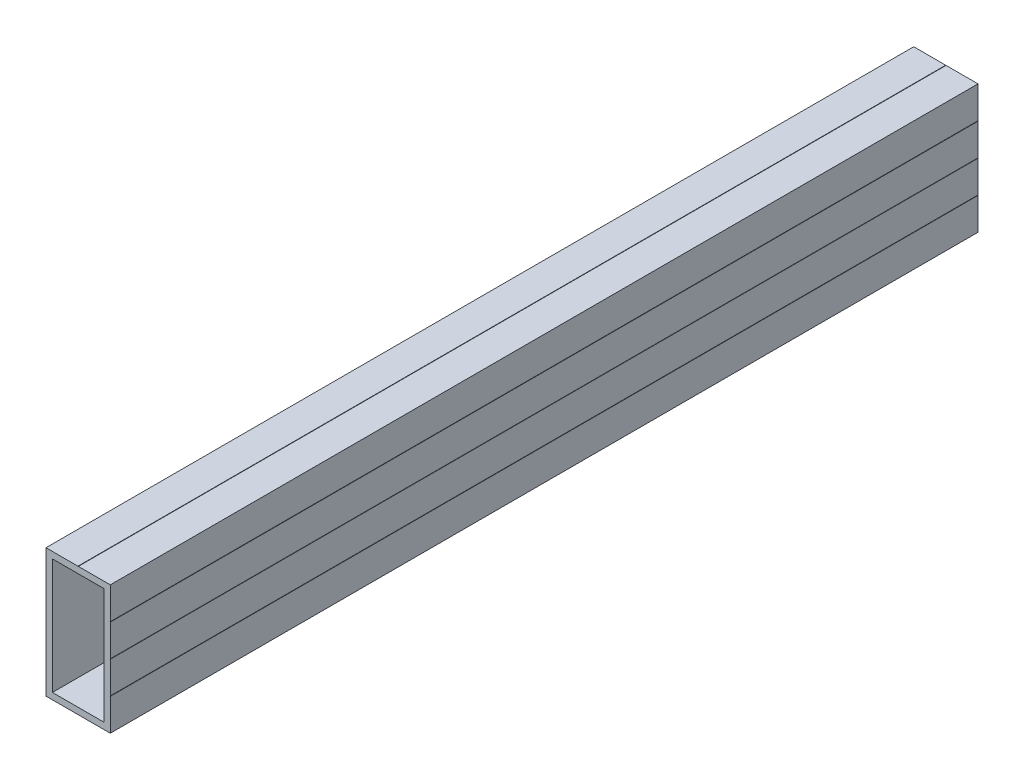
ISO-10303-21;
HEADER;
FILE_DESCRIPTION(('STEP AP214'),'2;1');
FILE_NAME('part.step','',(''),(''),'','','');
FILE_SCHEMA(('AUTOMOTIVE_DESIGN { 1 0 10303 214 1 1 1 1 }'));
ENDSEC;
DATA;
#1=APPLICATION_CONTEXT('core data for automotive mechanical design processes');
#2=APPLICATION_PROTOCOL_DEFINITION('international standard','automotive_design',2000,#1);
#3=PRODUCT_CONTEXT('',#1,'mechanical');
#4=PRODUCT('Part','Part','',(#3));
#5=PRODUCT_RELATED_PRODUCT_CATEGORY('part','',(#4));
#6=PRODUCT_DEFINITION_FORMATION('','',#4);
#7=PRODUCT_DEFINITION_CONTEXT('part definition',#1,'design');
#8=PRODUCT_DEFINITION('design','',#6,#7);
#9=PRODUCT_DEFINITION_SHAPE('','',#8);
#10=(LENGTH_UNIT() NAMED_UNIT(*) SI_UNIT(.MILLI.,.METRE.));
#11=(NAMED_UNIT(*) PLANE_ANGLE_UNIT() SI_UNIT($,.RADIAN.));
#12=(NAMED_UNIT(*) SI_UNIT($,.STERADIAN.) SOLID_ANGLE_UNIT());
#13=UNCERTAINTY_MEASURE_WITH_UNIT(LENGTH_MEASURE(1.E-05),#10,'distance_accuracy_value','');
#14=(GEOMETRIC_REPRESENTATION_CONTEXT(3) GLOBAL_UNCERTAINTY_ASSIGNED_CONTEXT((#13)) GLOBAL_UNIT_ASSIGNED_CONTEXT((#10,
#11,#12)) REPRESENTATION_CONTEXT('',''));
#15=CARTESIAN_POINT('',(0.,0.,0.));
#16=DIRECTION('',(0.,0.,1.));
#17=DIRECTION('',(1.,0.,0.));
#18=AXIS2_PLACEMENT_3D('',#15,#16,#17);
#19=CARTESIAN_POINT('',(-12.7,0.,0.));
#20=DIRECTION('',(1.,0.,0.));
#21=DIRECTION('',(0.,0.,-1.));
#22=AXIS2_PLACEMENT_3D('',#19,#20,#21);
#23=PLANE('',#22);
#24=DIRECTION('',(0.,0.,1.));
#25=VECTOR('',#24,1.);
#26=CARTESIAN_POINT('',(-12.7,25.4,-749.3));
#27=LINE('',#26,#25);
#28=CARTESIAN_POINT('',(-12.7,25.4,406.4));
#29=VERTEX_POINT('',#28);
#30=CARTESIAN_POINT('',(-12.7,25.4,749.3));
#31=VERTEX_POINT('',#30);
#32=EDGE_CURVE('E335',#29,#31,#27,.T.);
#33=ORIENTED_EDGE('',*,*,#32,.F.);
#34=DIRECTION('',(0.,-1.,0.));
#35=VECTOR('',#34,1.);
#36=CARTESIAN_POINT('',(-12.7,0.,406.4));
#37=LINE('',#36,#35);
#38=CARTESIAN_POINT('',(-12.7000000000132,12.7762,406.4));
#39=VERTEX_POINT('',#38);
#40=EDGE_CURVE('E408',#29,#39,#37,.T.);
#41=ORIENTED_EDGE('',*,*,#40,.T.);
#42=DIRECTION('',(0.,0.,1.));
#43=VECTOR('',#42,1.);
#44=CARTESIAN_POINT('',(-12.7000000000132,12.7762,-749.3));
#45=LINE('',#44,#43);
#46=CARTESIAN_POINT('',(-12.7000000000132,12.7762,749.3));
#47=VERTEX_POINT('',#46);
#48=EDGE_CURVE('E271',#39,#47,#45,.T.);
#49=ORIENTED_EDGE('',*,*,#48,.T.);
#50=DIRECTION('',(0.,-1.,0.));
#51=VECTOR('',#50,1.);
#52=CARTESIAN_POINT('',(-12.7,25.4,749.3));
#53=LINE('',#52,#51);
#54=EDGE_CURVE('E339',#31,#47,#53,.T.);
#55=ORIENTED_EDGE('',*,*,#54,.F.);
#56=EDGE_LOOP('',(#33,#41,#49,#55));
#57=FACE_BOUND('',#56,.T.);
#58=ADVANCED_FACE('F34',(#57),#23,.F.);
#59=DIRECTION('',(0.,0.,-1.));
#60=VECTOR('',#59,1.);
#61=CARTESIAN_POINT('',(-12.7,12.6238000000132,0.));
#62=LINE('',#61,#60);
#63=CARTESIAN_POINT('',(-12.7,12.6238000000132,406.4));
#64=VERTEX_POINT('',#63);
#65=CARTESIAN_POINT('',(-12.7,12.6238000000132,749.3));
#66=VERTEX_POINT('',#65);
#67=EDGE_CURVE('E273',#64,#66,#62,.F.);
#68=ORIENTED_EDGE('',*,*,#67,.F.);
#69=DIRECTION('',(0.,-1.,0.));
#70=VECTOR('',#69,1.);
#71=CARTESIAN_POINT('',(-12.7,0.,406.4));
#72=LINE('',#71,#70);
#73=CARTESIAN_POINT('',(-12.7,0.0761999999999976,406.4));
#74=VERTEX_POINT('',#73);
#75=EDGE_CURVE('E49',#64,#74,#72,.T.);
#76=ORIENTED_EDGE('',*,*,#75,.T.);
#77=DIRECTION('',(0.,0.,1.));
#78=VECTOR('',#77,1.);
#79=CARTESIAN_POINT('',(-12.7,0.0761999999999976,-749.3));
#80=LINE('',#79,#78);
#81=CARTESIAN_POINT('',(-12.7,0.0761999999999976,749.3));
#82=VERTEX_POINT('',#81);
#83=EDGE_CURVE('E279',#74,#82,#80,.T.);
#84=ORIENTED_EDGE('',*,*,#83,.T.);
#85=EDGE_CURVE('E343',#66,#82,#53,.T.);
#86=ORIENTED_EDGE('',*,*,#85,.F.);
#87=EDGE_LOOP('',(#68,#76,#84,#86));
#88=FACE_BOUND('',#87,.T.);
#89=ADVANCED_FACE('F511',(#88),#23,.F.);
#90=DIRECTION('',(0.,0.,-1.));
#91=VECTOR('',#90,1.);
#92=CARTESIAN_POINT('',(-12.7,-0.0761999999999985,0.));
#93=LINE('',#92,#91);
#94=CARTESIAN_POINT('',(-12.7,-0.0761999999999982,406.4));
#95=VERTEX_POINT('',#94);
#96=CARTESIAN_POINT('',(-12.7,-0.0761999999999985,749.3));
#97=VERTEX_POINT('',#96);
#98=EDGE_CURVE('E281',#95,#97,#93,.F.);
#99=ORIENTED_EDGE('',*,*,#98,.F.);
#100=DIRECTION('',(0.,-1.,0.));
#101=VECTOR('',#100,1.);
#102=CARTESIAN_POINT('',(-12.7,0.,406.4));
#103=LINE('',#102,#101);
#104=CARTESIAN_POINT('',(-12.7,-12.6238,406.4));
#105=VERTEX_POINT('',#104);
#106=EDGE_CURVE('E430',#95,#105,#103,.T.);
#107=ORIENTED_EDGE('',*,*,#106,.T.);
#108=DIRECTION('',(0.,0.,1.));
#109=VECTOR('',#108,1.);
#110=CARTESIAN_POINT('',(-12.7,-12.6238,-749.3));
#111=LINE('',#110,#109);
#112=CARTESIAN_POINT('',(-12.7,-12.6238,749.3));
#113=VERTEX_POINT('',#112);
#114=EDGE_CURVE('E290',#105,#113,#111,.T.);
#115=ORIENTED_EDGE('',*,*,#114,.T.);
#116=EDGE_CURVE('E594',#97,#113,#53,.T.);
#117=ORIENTED_EDGE('',*,*,#116,.F.);
#118=EDGE_LOOP('',(#99,#107,#115,#117));
#119=FACE_BOUND('',#118,.T.);
#120=ADVANCED_FACE('F504',(#119),#23,.F.);
#121=CARTESIAN_POINT('',(-12.7,-25.4,749.3));
#122=DIRECTION('',(0.,-1.,0.));
#123=DIRECTION('',(0.,0.,-1.));
#124=AXIS2_PLACEMENT_3D('',#121,#122,#123);
#125=PLANE('',#124);
#126=DIRECTION('',(-1.,0.,0.));
#127=VECTOR('',#126,1.);
#128=CARTESIAN_POINT('',(-12.7,-25.4,406.4));
#129=LINE('',#128,#127);
#130=CARTESIAN_POINT('',(-0.0762000000000089,-25.4,406.4));
#131=VERTEX_POINT('',#130);
#132=CARTESIAN_POINT('',(-12.7,-25.4,406.4));
#133=VERTEX_POINT('',#132);
#134=EDGE_CURVE('E452',#131,#133,#129,.T.);
#135=ORIENTED_EDGE('',*,*,#134,.F.);
#136=DIRECTION('',(0.,0.,1.));
#137=VECTOR('',#136,1.);
#138=CARTESIAN_POINT('',(-0.0762000000000087,-25.4,-749.3));
#139=LINE('',#138,#137);
#140=CARTESIAN_POINT('',(-0.0762000000000087,-25.4,749.3));
#141=VERTEX_POINT('',#140);
#142=EDGE_CURVE('E296',#131,#141,#139,.T.);
#143=ORIENTED_EDGE('',*,*,#142,.T.);
#144=DIRECTION('',(1.,0.,0.));
#145=VECTOR('',#144,1.);
#146=CARTESIAN_POINT('',(-12.7,-25.4,749.3));
#147=LINE('',#146,#145);
#148=CARTESIAN_POINT('',(-12.7,-25.4,749.3));
#149=VERTEX_POINT('',#148);
#150=EDGE_CURVE('E42',#149,#141,#147,.T.);
#151=ORIENTED_EDGE('',*,*,#150,.F.);
#152=DIRECTION('',(0.,0.,-1.));
#153=VECTOR('',#152,1.);
#154=CARTESIAN_POINT('',(-12.7,-25.4,749.3));
#155=LINE('',#154,#153);
#156=EDGE_CURVE('E342',#149,#133,#155,.T.);
#157=ORIENTED_EDGE('',*,*,#156,.T.);
#158=EDGE_LOOP('',(#135,#143,#151,#157));
#159=FACE_BOUND('',#158,.T.);
#160=ADVANCED_FACE('F508',(#159),#125,.T.);
#161=CARTESIAN_POINT('',(12.7,0.,0.));
#162=DIRECTION('',(1.,0.,0.));
#163=DIRECTION('',(0.,0.,-1.));
#164=AXIS2_PLACEMENT_3D('',#161,#162,#163);
#165=PLANE('',#164);
#166=DIRECTION('',(0.,-1.,0.));
#167=VECTOR('',#166,1.);
#168=CARTESIAN_POINT('',(12.7,0.,406.4));
#169=LINE('',#168,#167);
#170=CARTESIAN_POINT('',(12.7,-12.7762,406.4));
#171=VERTEX_POINT('',#170);
#172=CARTESIAN_POINT('',(12.7,-25.4,406.4));
#173=VERTEX_POINT('',#172);
#174=EDGE_CURVE('E476',#171,#173,#169,.T.);
#175=ORIENTED_EDGE('',*,*,#174,.F.);
#176=DIRECTION('',(0.,0.,1.));
#177=VECTOR('',#176,1.);
#178=CARTESIAN_POINT('',(12.7,-12.7762,-749.3));
#179=LINE('',#178,#177);
#180=CARTESIAN_POINT('',(12.7,-12.7762,749.3));
#181=VERTEX_POINT('',#180);
#182=EDGE_CURVE('E305',#171,#181,#179,.T.);
#183=ORIENTED_EDGE('',*,*,#182,.T.);
#184=DIRECTION('',(0.,-1.,0.));
#185=VECTOR('',#184,1.);
#186=CARTESIAN_POINT('',(12.7,25.4,749.3));
#187=LINE('',#186,#185);
#188=CARTESIAN_POINT('',(12.7,-25.4,749.3));
#189=VERTEX_POINT('',#188);
#190=EDGE_CURVE('E349',#181,#189,#187,.T.);
#191=ORIENTED_EDGE('',*,*,#190,.T.);
#192=DIRECTION('',(0.,0.,-1.));
#193=VECTOR('',#192,1.);
#194=CARTESIAN_POINT('',(12.7,-25.4,749.3));
#195=LINE('',#194,#193);
#196=EDGE_CURVE('E338',#189,#173,#195,.T.);
#197=ORIENTED_EDGE('',*,*,#196,.T.);
#198=EDGE_LOOP('',(#175,#183,#191,#197));
#199=FACE_BOUND('',#198,.T.);
#200=ADVANCED_FACE('F523',(#199),#165,.T.);
#201=DIRECTION('',(0.,-1.,0.));
#202=VECTOR('',#201,1.);
#203=CARTESIAN_POINT('',(12.7,0.,406.4));
#204=LINE('',#203,#202);
#205=CARTESIAN_POINT('',(12.7,-0.0762000000000003,406.4));
#206=VERTEX_POINT('',#205);
#207=CARTESIAN_POINT('',(12.7,-12.6238,406.4));
#208=VERTEX_POINT('',#207);
#209=EDGE_CURVE('E463',#206,#208,#204,.T.);
#210=ORIENTED_EDGE('',*,*,#209,.F.);
#211=DIRECTION('',(0.,0.,1.));
#212=VECTOR('',#211,1.);
#213=CARTESIAN_POINT('',(12.7,-0.0762000000000003,-749.3));
#214=LINE('',#213,#212);
#215=CARTESIAN_POINT('',(12.7,-0.0762000000000003,749.3));
#216=VERTEX_POINT('',#215);
#217=EDGE_CURVE('E313',#206,#216,#214,.T.);
#218=ORIENTED_EDGE('',*,*,#217,.T.);
#219=CARTESIAN_POINT('',(12.7,-12.6238,749.3));
#220=VERTEX_POINT('',#219);
#221=EDGE_CURVE('E555',#216,#220,#187,.T.);
#222=ORIENTED_EDGE('',*,*,#221,.T.);
#223=DIRECTION('',(0.,0.,-1.));
#224=VECTOR('',#223,1.);
#225=CARTESIAN_POINT('',(12.7,-12.6238,0.));
#226=LINE('',#225,#224);
#227=EDGE_CURVE('E307',#208,#220,#226,.F.);
#228=ORIENTED_EDGE('',*,*,#227,.F.);
#229=EDGE_LOOP('',(#210,#218,#222,#228));
#230=FACE_BOUND('',#229,.T.);
#231=ADVANCED_FACE('F532',(#230),#165,.T.);
#232=DIRECTION('',(0.,-1.,0.));
#233=VECTOR('',#232,1.);
#234=CARTESIAN_POINT('',(12.7,0.,406.4));
#235=LINE('',#234,#233);
#236=CARTESIAN_POINT('',(12.6999999999868,12.6238,406.4));
#237=VERTEX_POINT('',#236);
#238=CARTESIAN_POINT('',(12.7,0.0761999999999985,406.4));
#239=VERTEX_POINT('',#238);
#240=EDGE_CURVE('E450',#237,#239,#235,.T.);
#241=ORIENTED_EDGE('',*,*,#240,.F.);
#242=DIRECTION('',(0.,0.,1.));
#243=VECTOR('',#242,1.);
#244=CARTESIAN_POINT('',(12.6999999999868,12.6238,-749.3));
#245=LINE('',#244,#243);
#246=CARTESIAN_POINT('',(12.6999999999868,12.6238,749.3));
#247=VERTEX_POINT('',#246);
#248=EDGE_CURVE('E324',#237,#247,#245,.T.);
#249=ORIENTED_EDGE('',*,*,#248,.T.);
#250=CARTESIAN_POINT('',(12.7,0.0761999999999985,749.3));
#251=VERTEX_POINT('',#250);
#252=EDGE_CURVE('E353',#247,#251,#187,.T.);
#253=ORIENTED_EDGE('',*,*,#252,.T.);
#254=DIRECTION('',(0.,0.,-1.));
#255=VECTOR('',#254,1.);
#256=CARTESIAN_POINT('',(12.7,0.0761999999999985,0.));
#257=LINE('',#256,#255);
#258=EDGE_CURVE('E315',#239,#251,#257,.F.);
#259=ORIENTED_EDGE('',*,*,#258,.F.);
#260=EDGE_LOOP('',(#241,#249,#253,#259));
#261=FACE_BOUND('',#260,.T.);
#262=ADVANCED_FACE('F524',(#261),#165,.T.);
#263=CARTESIAN_POINT('',(-12.7,25.4,-749.3));
#264=DIRECTION('',(0.,1.,0.));
#265=DIRECTION('',(0.,0.,1.));
#266=AXIS2_PLACEMENT_3D('',#263,#264,#265);
#267=PLANE('',#266);
#268=DIRECTION('',(1.,0.,0.));
#269=VECTOR('',#268,1.);
#270=CARTESIAN_POINT('',(-12.7,25.4,406.4));
#271=LINE('',#270,#269);
#272=CARTESIAN_POINT('',(0.0761999999999968,25.4,406.4));
#273=VERTEX_POINT('',#272);
#274=CARTESIAN_POINT('',(12.7,25.4,406.4));
#275=VERTEX_POINT('',#274);
#276=EDGE_CURVE('E428',#273,#275,#271,.T.);
#277=ORIENTED_EDGE('',*,*,#276,.F.);
#278=DIRECTION('',(0.,0.,1.));
#279=VECTOR('',#278,1.);
#280=CARTESIAN_POINT('',(0.0761999999999968,25.4,-749.3));
#281=LINE('',#280,#279);
#282=CARTESIAN_POINT('',(0.0761999999999968,25.4,749.3));
#283=VERTEX_POINT('',#282);
#284=EDGE_CURVE('E329',#273,#283,#281,.T.);
#285=ORIENTED_EDGE('',*,*,#284,.T.);
#286=DIRECTION('',(1.,0.,0.));
#287=VECTOR('',#286,1.);
#288=CARTESIAN_POINT('',(-12.7,25.4,749.3));
#289=LINE('',#288,#287);
#290=CARTESIAN_POINT('',(12.7,25.4,749.3));
#291=VERTEX_POINT('',#290);
#292=EDGE_CURVE('E346',#283,#291,#289,.T.);
#293=ORIENTED_EDGE('',*,*,#292,.T.);
#294=DIRECTION('',(0.,0.,1.));
#295=VECTOR('',#294,1.);
#296=CARTESIAN_POINT('',(12.7,25.4,-749.3));
#297=LINE('',#296,#295);
#298=EDGE_CURVE('E347',#275,#291,#297,.T.);
#299=ORIENTED_EDGE('',*,*,#298,.F.);
#300=EDGE_LOOP('',(#277,#285,#293,#299));
#301=FACE_BOUND('',#300,.T.);
#302=ADVANCED_FACE('F535',(#301),#267,.T.);
#303=DIRECTION('',(1.,0.,0.));
#304=VECTOR('',#303,1.);
#305=CARTESIAN_POINT('',(-12.7,25.4,406.4));
#306=LINE('',#305,#304);
#307=CARTESIAN_POINT('',(-0.0761999999999985,25.4,406.4));
#308=VERTEX_POINT('',#307);
#309=EDGE_CURVE('E413',#29,#308,#306,.T.);
#310=ORIENTED_EDGE('',*,*,#309,.F.);
#311=ORIENTED_EDGE('',*,*,#32,.T.);
#312=CARTESIAN_POINT('',(-0.0761999999999985,25.4,749.3));
#313=VERTEX_POINT('',#312);
#314=EDGE_CURVE('E359',#31,#313,#289,.T.);
#315=ORIENTED_EDGE('',*,*,#314,.T.);
#316=DIRECTION('',(0.,0.,1.));
#317=VECTOR('',#316,1.);
#318=CARTESIAN_POINT('',(-0.0761999999999985,25.4,-749.3));
#319=LINE('',#318,#317);
#320=EDGE_CURVE('E331',#308,#313,#319,.T.);
#321=ORIENTED_EDGE('',*,*,#320,.F.);
#322=EDGE_LOOP('',(#310,#311,#315,#321));
#323=FACE_BOUND('',#322,.T.);
#324=ADVANCED_FACE('F505',(#323),#267,.T.);
#325=DIRECTION('',(-1.,0.,0.));
#326=VECTOR('',#325,1.);
#327=CARTESIAN_POINT('',(-12.7,-25.4,406.4));
#328=LINE('',#327,#326);
#329=CARTESIAN_POINT('',(0.0761999999999916,-25.4,406.4));
#330=VERTEX_POINT('',#329);
#331=EDGE_CURVE('E474',#173,#330,#328,.T.);
#332=ORIENTED_EDGE('',*,*,#331,.F.);
#333=ORIENTED_EDGE('',*,*,#196,.F.);
#334=CARTESIAN_POINT('',(0.0761999999999898,-25.4,749.3));
#335=VERTEX_POINT('',#334);
#336=EDGE_CURVE('E358',#335,#189,#147,.T.);
#337=ORIENTED_EDGE('',*,*,#336,.F.);
#338=DIRECTION('',(0.,0.,1.));
#339=VECTOR('',#338,1.);
#340=CARTESIAN_POINT('',(0.0761999999999916,-25.4,-749.3));
#341=LINE('',#340,#339);
#342=EDGE_CURVE('E300',#330,#335,#341,.T.);
#343=ORIENTED_EDGE('',*,*,#342,.F.);
#344=EDGE_LOOP('',(#332,#333,#337,#343));
#345=FACE_BOUND('',#344,.T.);
#346=ADVANCED_FACE('F495',(#345),#125,.T.);
#347=CARTESIAN_POINT('',(-12.7,25.4,749.3));
#348=DIRECTION('',(0.,0.,1.));
#349=DIRECTION('',(1.,0.,0.));
#350=AXIS2_PLACEMENT_3D('',#347,#348,#349);
#351=PLANE('',#350);
#352=DIRECTION('',(1.,0.,0.));
#353=VECTOR('',#352,1.);
#354=CARTESIAN_POINT('',(-10.16,-22.86,749.3));
#355=LINE('',#354,#353);
#356=CARTESIAN_POINT('',(-10.16,-22.86,749.3));
#357=VERTEX_POINT('',#356);
#358=CARTESIAN_POINT('',(10.16,-22.86,749.3));
#359=VERTEX_POINT('',#358);
#360=EDGE_CURVE('E478',#357,#359,#355,.T.);
#361=ORIENTED_EDGE('',*,*,#360,.F.);
#362=DIRECTION('',(0.,-1.,0.));
#363=VECTOR('',#362,1.);
#364=CARTESIAN_POINT('',(-10.16,22.86,749.3));
#365=LINE('',#364,#363);
#366=CARTESIAN_POINT('',(-10.16,22.86,749.3));
#367=VERTEX_POINT('',#366);
#368=EDGE_CURVE('E263',#367,#357,#365,.T.);
#369=ORIENTED_EDGE('',*,*,#368,.F.);
#370=DIRECTION('',(-1.,0.,0.));
#371=VECTOR('',#370,1.);
#372=CARTESIAN_POINT('',(10.16,22.86,749.3));
#373=LINE('',#372,#371);
#374=CARTESIAN_POINT('',(10.16,22.86,749.3));
#375=VERTEX_POINT('',#374);
#376=EDGE_CURVE('E482',#375,#367,#373,.T.);
#377=ORIENTED_EDGE('',*,*,#376,.F.);
#378=DIRECTION('',(0.,1.,0.));
#379=VECTOR('',#378,1.);
#380=CARTESIAN_POINT('',(10.16,-22.86,749.3));
#381=LINE('',#380,#379);
#382=EDGE_CURVE('E257',#359,#375,#381,.T.);
#383=ORIENTED_EDGE('',*,*,#382,.F.);
#384=EDGE_LOOP('',(#361,#369,#377,#383));
#385=FACE_BOUND('',#384,.T.);
#386=DIRECTION('',(-0.707106781186539,0.707106781186555,0.));
#387=VECTOR('',#386,1.);
#388=CARTESIAN_POINT('',(-12.5476000000263,12.6238000000132,749.3));
#389=LINE('',#388,#387);
#390=CARTESIAN_POINT('',(-12.6238000000066,12.6999999999934,749.3));
#391=VERTEX_POINT('',#390);
#392=EDGE_CURVE('E267',#391,#47,#389,.T.);
#393=ORIENTED_EDGE('',*,*,#392,.F.);
#394=DIRECTION('',(-0.707106781247692,-0.707106781125403,0.));
#395=VECTOR('',#394,1.);
#396=CARTESIAN_POINT('',(-6.3119000000066,19.0118999989018,749.3));
#397=LINE('',#396,#395);
#398=EDGE_CURVE('E270',#66,#391,#397,.F.);
#399=ORIENTED_EDGE('',*,*,#398,.F.);
#400=ORIENTED_EDGE('',*,*,#85,.T.);
#401=DIRECTION('',(-1.,0.,0.));
#402=VECTOR('',#401,1.);
#403=CARTESIAN_POINT('',(-12.5476,0.0761999999999985,749.3));
#404=LINE('',#403,#402);
#405=CARTESIAN_POINT('',(-12.5475999999737,0.0761999999999985,749.3));
#406=VERTEX_POINT('',#405);
#407=EDGE_CURVE('E274',#406,#82,#404,.T.);
#408=ORIENTED_EDGE('',*,*,#407,.F.);
#409=DIRECTION('',(-0.707106781247692,-0.707106781125403,0.));
#410=VECTOR('',#409,1.);
#411=CARTESIAN_POINT('',(0.0380999999999923,12.661899997797,749.3));
#412=LINE('',#411,#410);
#413=EDGE_CURVE('E277',#97,#406,#412,.F.);
#414=ORIENTED_EDGE('',*,*,#413,.F.);
#415=ORIENTED_EDGE('',*,*,#116,.T.);
#416=DIRECTION('',(-0.707106781186551,0.707106781186543,0.));
#417=VECTOR('',#416,1.);
#418=CARTESIAN_POINT('',(-12.5476,-12.7762,749.3));
#419=LINE('',#418,#417);
#420=CARTESIAN_POINT('',(-12.6238,-12.7,749.3));
#421=VERTEX_POINT('',#420);
#422=EDGE_CURVE('E282',#421,#113,#419,.T.);
#423=ORIENTED_EDGE('',*,*,#422,.F.);
#424=DIRECTION('',(-0.707106781186537,-0.707106781186558,0.));
#425=VECTOR('',#424,1.);
#426=CARTESIAN_POINT('',(6.38809999999999,6.31190000000056,749.3));
#427=LINE('',#426,#425);
#428=CARTESIAN_POINT('',(-12.7,-12.7762,749.3));
#429=VERTEX_POINT('',#428);
#430=EDGE_CURVE('E285',#429,#421,#427,.F.);
#431=ORIENTED_EDGE('',*,*,#430,.F.);
#432=EDGE_CURVE('E337',#429,#149,#53,.T.);
#433=ORIENTED_EDGE('',*,*,#432,.T.);
#434=ORIENTED_EDGE('',*,*,#150,.T.);
#435=DIRECTION('',(0.707106781186552,0.707106781186544,0.));
#436=VECTOR('',#435,1.);
#437=CARTESIAN_POINT('',(19.0118999999999,-6.31190000000029,749.3));
#438=LINE('',#437,#436);
#439=CARTESIAN_POINT('',(0.,-25.3238,749.3));
#440=VERTEX_POINT('',#439);
#441=EDGE_CURVE('E295',#440,#141,#438,.F.);
#442=ORIENTED_EDGE('',*,*,#441,.F.);
#443=DIRECTION('',(-0.707106781186547,0.707106781186548,0.));
#444=VECTOR('',#443,1.);
#445=CARTESIAN_POINT('',(0.0761999999999916,-25.4,749.3));
#446=LINE('',#445,#444);
#447=EDGE_CURVE('E292',#335,#440,#446,.T.);
#448=ORIENTED_EDGE('',*,*,#447,.F.);
#449=ORIENTED_EDGE('',*,*,#336,.T.);
#450=ORIENTED_EDGE('',*,*,#190,.F.);
#451=DIRECTION('',(0.707106781186539,-0.707106781186556,0.));
#452=VECTOR('',#451,1.);
#453=CARTESIAN_POINT('',(12.5476,-12.6238,749.3));
#454=LINE('',#453,#452);
#455=CARTESIAN_POINT('',(12.6238,-12.7,749.3));
#456=VERTEX_POINT('',#455);
#457=EDGE_CURVE('E298',#456,#181,#454,.T.);
#458=ORIENTED_EDGE('',*,*,#457,.F.);
#459=DIRECTION('',(0.707106781186553,0.707106781186542,0.));
#460=VECTOR('',#459,1.);
#461=CARTESIAN_POINT('',(19.0118999999998,-6.3119000000003,749.3));
#462=LINE('',#461,#460);
#463=EDGE_CURVE('E304',#220,#456,#462,.F.);
#464=ORIENTED_EDGE('',*,*,#463,.F.);
#465=ORIENTED_EDGE('',*,*,#221,.F.);
#466=DIRECTION('',(1.,0.,0.));
#467=VECTOR('',#466,1.);
#468=CARTESIAN_POINT('',(12.5476,-0.0761999999999985,749.3));
#469=LINE('',#468,#467);
#470=CARTESIAN_POINT('',(12.5476,-0.0761999999999985,749.3));
#471=VERTEX_POINT('',#470);
#472=EDGE_CURVE('E308',#471,#216,#469,.T.);
#473=ORIENTED_EDGE('',*,*,#472,.F.);
#474=DIRECTION('',(0.707106781186553,0.707106781186542,0.));
#475=VECTOR('',#474,1.);
#476=CARTESIAN_POINT('',(12.6618999999998,0.038099999999798,749.3));
#477=LINE('',#476,#475);
#478=EDGE_CURVE('E311',#251,#471,#477,.F.);
#479=ORIENTED_EDGE('',*,*,#478,.F.);
#480=ORIENTED_EDGE('',*,*,#252,.F.);
#481=DIRECTION('',(0.707106781186544,-0.707106781186552,0.));
#482=VECTOR('',#481,1.);
#483=CARTESIAN_POINT('',(12.5475999999736,12.7762000000132,749.3));
#484=LINE('',#483,#482);
#485=CARTESIAN_POINT('',(12.6237999999868,12.7,749.3));
#486=VERTEX_POINT('',#485);
#487=EDGE_CURVE('E316',#486,#247,#484,.T.);
#488=ORIENTED_EDGE('',*,*,#487,.F.);
#489=DIRECTION('',(0.707106781125415,0.707106781247681,0.));
#490=VECTOR('',#489,1.);
#491=CARTESIAN_POINT('',(6.31190000218278,6.38810000110456,749.3));
#492=LINE('',#491,#490);
#493=CARTESIAN_POINT('',(12.6999999999868,12.7762000000132,749.3));
#494=VERTEX_POINT('',#493);
#495=EDGE_CURVE('E319',#494,#486,#492,.F.);
#496=ORIENTED_EDGE('',*,*,#495,.F.);
#497=EDGE_CURVE('E350',#291,#494,#187,.T.);
#498=ORIENTED_EDGE('',*,*,#497,.F.);
#499=ORIENTED_EDGE('',*,*,#292,.F.);
#500=DIRECTION('',(-0.707106781186552,-0.707106781186543,0.));
#501=VECTOR('',#500,1.);
#502=CARTESIAN_POINT('',(-6.31190000000008,19.0119,749.3));
#503=LINE('',#502,#501);
#504=CARTESIAN_POINT('',(0.,25.3238,749.3));
#505=VERTEX_POINT('',#504);
#506=EDGE_CURVE('E330',#505,#283,#503,.F.);
#507=ORIENTED_EDGE('',*,*,#506,.F.);
#508=DIRECTION('',(0.707106781186548,-0.707106781186547,0.));
#509=VECTOR('',#508,1.);
#510=CARTESIAN_POINT('',(-0.0761999999999985,25.4,749.3));
#511=LINE('',#510,#509);
#512=EDGE_CURVE('E326',#313,#505,#511,.T.);
#513=ORIENTED_EDGE('',*,*,#512,.F.);
#514=ORIENTED_EDGE('',*,*,#314,.F.);
#515=ORIENTED_EDGE('',*,*,#54,.T.);
#516=EDGE_LOOP('',(#393,#399,#400,#408,#414,#415,#423,#431,#433,#434,#442,#448,#449,#450,#458,
#464,#465,#473,#479,#480,#488,#496,#498,#499,#507,#513,#514,#515));
#517=FACE_BOUND('',#516,.T.);
#518=ADVANCED_FACE('F401',(#385,#517),#351,.T.);
#519=DIRECTION('',(0.,0.,1.));
#520=VECTOR('',#519,1.);
#521=CARTESIAN_POINT('',(-12.7,-12.7762,-749.3));
#522=LINE('',#521,#520);
#523=CARTESIAN_POINT('',(-12.7,-12.7762,406.4));
#524=VERTEX_POINT('',#523);
#525=EDGE_CURVE('E287',#524,#429,#522,.T.);
#526=ORIENTED_EDGE('',*,*,#525,.F.);
#527=DIRECTION('',(0.,-1.,0.));
#528=VECTOR('',#527,1.);
#529=CARTESIAN_POINT('',(-12.7,0.,406.4));
#530=LINE('',#529,#528);
#531=EDGE_CURVE('E447',#524,#133,#530,.T.);
#532=ORIENTED_EDGE('',*,*,#531,.T.);
#533=ORIENTED_EDGE('',*,*,#156,.F.);
#534=ORIENTED_EDGE('',*,*,#432,.F.);
#535=EDGE_LOOP('',(#526,#532,#533,#534));
#536=FACE_BOUND('',#535,.T.);
#537=ADVANCED_FACE('F494',(#536),#23,.F.);
#538=DIRECTION('',(0.,-1.,0.));
#539=VECTOR('',#538,1.);
#540=CARTESIAN_POINT('',(12.7,0.,406.4));
#541=LINE('',#540,#539);
#542=CARTESIAN_POINT('',(12.7,12.7762000000132,406.4));
#543=VERTEX_POINT('',#542);
#544=EDGE_CURVE('E436',#275,#543,#541,.T.);
#545=ORIENTED_EDGE('',*,*,#544,.F.);
#546=ORIENTED_EDGE('',*,*,#298,.T.);
#547=ORIENTED_EDGE('',*,*,#497,.T.);
#548=DIRECTION('',(0.,0.,1.));
#549=VECTOR('',#548,1.);
#550=CARTESIAN_POINT('',(12.6999999999868,12.7762000000132,-749.3));
#551=LINE('',#550,#549);
#552=EDGE_CURVE('E321',#543,#494,#551,.T.);
#553=ORIENTED_EDGE('',*,*,#552,.F.);
#554=EDGE_LOOP('',(#545,#546,#547,#553));
#555=FACE_BOUND('',#554,.T.);
#556=ADVANCED_FACE('F501',(#555),#165,.T.);
#557=CARTESIAN_POINT('',(0.0761999999999968,25.4,-749.3));
#558=DIRECTION('',(-0.707106781186543,0.707106781186552,0.));
#559=DIRECTION('',(-0.707106781186552,-0.707106781186543,0.));
#560=AXIS2_PLACEMENT_3D('',#557,#558,#559);
#561=PLANE('',#560);
#562=ORIENTED_EDGE('',*,*,#284,.F.);
#563=DIRECTION('',(0.707106781186552,0.707106781186543,0.));
#564=VECTOR('',#563,1.);
#565=CARTESIAN_POINT('',(0.0761999999999968,25.4,406.4));
#566=LINE('',#565,#564);
#567=CARTESIAN_POINT('',(0.,25.3238,406.4));
#568=VERTEX_POINT('',#567);
#569=EDGE_CURVE('E425',#273,#568,#566,.F.);
#570=ORIENTED_EDGE('',*,*,#569,.T.);
#571=DIRECTION('',(0.,0.,-1.));
#572=VECTOR('',#571,1.);
#573=CARTESIAN_POINT('',(0.,25.3238,-749.3));
#574=LINE('',#573,#572);
#575=EDGE_CURVE('E333',#568,#505,#574,.F.);
#576=ORIENTED_EDGE('',*,*,#575,.T.);
#577=ORIENTED_EDGE('',*,*,#506,.T.);
#578=EDGE_LOOP('',(#562,#570,#576,#577));
#579=FACE_BOUND('',#578,.T.);
#580=ADVANCED_FACE('F521',(#579),#561,.T.);
#581=CARTESIAN_POINT('',(-0.0761999999999985,25.4,-749.3));
#582=DIRECTION('',(-0.707106781186547,-0.707106781186547,0.));
#583=DIRECTION('',(0.707106781186548,-0.707106781186548,0.));
#584=AXIS2_PLACEMENT_3D('',#581,#582,#583);
#585=PLANE('',#584);
#586=ORIENTED_EDGE('',*,*,#575,.F.);
#587=DIRECTION('',(-0.707106781186548,0.707106781186548,0.));
#588=VECTOR('',#587,1.);
#589=CARTESIAN_POINT('',(-0.0761999999999985,25.4,406.4));
#590=LINE('',#589,#588);
#591=EDGE_CURVE('E422',#568,#308,#590,.T.);
#592=ORIENTED_EDGE('',*,*,#591,.T.);
#593=ORIENTED_EDGE('',*,*,#320,.T.);
#594=ORIENTED_EDGE('',*,*,#512,.T.);
#595=EDGE_LOOP('',(#586,#592,#593,#594));
#596=FACE_BOUND('',#595,.T.);
#597=ADVANCED_FACE('F518',(#596),#585,.F.);
#598=CARTESIAN_POINT('',(12.5475999999736,12.7762000000132,-749.3));
#599=DIRECTION('',(-0.707106781186551,-0.707106781186544,0.));
#600=DIRECTION('',(0.707106781186544,-0.707106781186551,0.));
#601=AXIS2_PLACEMENT_3D('',#598,#599,#600);
#602=PLANE('',#601);
#603=ORIENTED_EDGE('',*,*,#248,.F.);
#604=DIRECTION('',(-0.707106781186544,0.707106781186551,0.));
#605=VECTOR('',#604,1.);
#606=CARTESIAN_POINT('',(12.5475999999736,12.7762000000132,406.4));
#607=LINE('',#606,#605);
#608=CARTESIAN_POINT('',(12.6237999999868,12.7,406.4));
#609=VERTEX_POINT('',#608);
#610=EDGE_CURVE('E444',#237,#609,#607,.T.);
#611=ORIENTED_EDGE('',*,*,#610,.T.);
#612=DIRECTION('',(0.,0.,-1.));
#613=VECTOR('',#612,1.);
#614=CARTESIAN_POINT('',(12.6237999999868,12.7,-749.3));
#615=LINE('',#614,#613);
#616=EDGE_CURVE('E323',#609,#486,#615,.F.);
#617=ORIENTED_EDGE('',*,*,#616,.T.);
#618=ORIENTED_EDGE('',*,*,#487,.T.);
#619=EDGE_LOOP('',(#603,#611,#617,#618));
#620=FACE_BOUND('',#619,.T.);
#621=ADVANCED_FACE('F548',(#620),#602,.F.);
#622=CARTESIAN_POINT('',(12.6999999999868,12.7762000000132,-749.3));
#623=DIRECTION('',(0.70710678124768,-0.707106781125414,0.));
#624=DIRECTION('',(0.707106781125415,0.707106781247681,0.));
#625=AXIS2_PLACEMENT_3D('',#622,#623,#624);
#626=PLANE('',#625);
#627=ORIENTED_EDGE('',*,*,#616,.F.);
#628=DIRECTION('',(-0.707106781125415,-0.707106781247681,0.));
#629=VECTOR('',#628,1.);
#630=CARTESIAN_POINT('',(12.6999999999868,12.7762000000132,406.4));
#631=LINE('',#630,#629);
#632=EDGE_CURVE('E441',#609,#543,#631,.F.);
#633=ORIENTED_EDGE('',*,*,#632,.T.);
#634=ORIENTED_EDGE('',*,*,#552,.T.);
#635=ORIENTED_EDGE('',*,*,#495,.T.);
#636=EDGE_LOOP('',(#627,#633,#634,#635));
#637=FACE_BOUND('',#636,.T.);
#638=ADVANCED_FACE('F625',(#637),#626,.T.);
#639=CARTESIAN_POINT('',(12.5476,-0.0761999999999985,-749.3));
#640=DIRECTION('',(0.,-1.,0.));
#641=DIRECTION('',(1.,0.,0.));
#642=AXIS2_PLACEMENT_3D('',#639,#640,#641);
#643=PLANE('',#642);
#644=ORIENTED_EDGE('',*,*,#217,.F.);
#645=DIRECTION('',(-1.,0.,0.));
#646=VECTOR('',#645,1.);
#647=CARTESIAN_POINT('',(12.5476,-0.0761999999999985,406.4));
#648=LINE('',#647,#646);
#649=CARTESIAN_POINT('',(12.5476,-0.0761999999999975,406.4));
#650=VERTEX_POINT('',#649);
#651=EDGE_CURVE('E460',#206,#650,#648,.T.);
#652=ORIENTED_EDGE('',*,*,#651,.T.);
#653=DIRECTION('',(0.,0.,-1.));
#654=VECTOR('',#653,1.);
#655=CARTESIAN_POINT('',(12.5476,-0.0761999999999985,0.));
#656=LINE('',#655,#654);
#657=EDGE_CURVE('E320',#650,#471,#656,.F.);
#658=ORIENTED_EDGE('',*,*,#657,.T.);
#659=ORIENTED_EDGE('',*,*,#472,.T.);
#660=EDGE_LOOP('',(#644,#652,#658,#659));
#661=FACE_BOUND('',#660,.T.);
#662=ADVANCED_FACE('F623',(#661),#643,.F.);
#663=CARTESIAN_POINT('',(12.7,0.0761999999999985,0.));
#664=DIRECTION('',(0.707106781186542,-0.707106781186553,0.));
#665=DIRECTION('',(0.707106781186553,0.707106781186542,0.));
#666=AXIS2_PLACEMENT_3D('',#663,#664,#665);
#667=PLANE('',#666);
#668=ORIENTED_EDGE('',*,*,#657,.F.);
#669=DIRECTION('',(-0.707106781186553,-0.707106781186542,0.));
#670=VECTOR('',#669,1.);
#671=CARTESIAN_POINT('',(12.7,0.0761999999999985,406.4));
#672=LINE('',#671,#670);
#673=EDGE_CURVE('E457',#650,#239,#672,.F.);
#674=ORIENTED_EDGE('',*,*,#673,.T.);
#675=ORIENTED_EDGE('',*,*,#258,.T.);
#676=ORIENTED_EDGE('',*,*,#478,.T.);
#677=EDGE_LOOP('',(#668,#674,#675,#676));
#678=FACE_BOUND('',#677,.T.);
#679=ADVANCED_FACE('F621',(#678),#667,.T.);
#680=CARTESIAN_POINT('',(12.5476,-12.6238,-749.3));
#681=DIRECTION('',(-0.707106781186555,-0.707106781186539,0.));
#682=DIRECTION('',(0.70710678118654,-0.707106781186556,0.));
#683=AXIS2_PLACEMENT_3D('',#680,#681,#682);
#684=PLANE('',#683);
#685=ORIENTED_EDGE('',*,*,#182,.F.);
#686=DIRECTION('',(-0.70710678118654,0.707106781186556,0.));
#687=VECTOR('',#686,1.);
#688=CARTESIAN_POINT('',(12.5476,-12.6238,406.4));
#689=LINE('',#688,#687);
#690=CARTESIAN_POINT('',(12.6238,-12.7,406.4));
#691=VERTEX_POINT('',#690);
#692=EDGE_CURVE('E471',#171,#691,#689,.T.);
#693=ORIENTED_EDGE('',*,*,#692,.T.);
#694=DIRECTION('',(0.,0.,-1.));
#695=VECTOR('',#694,1.);
#696=CARTESIAN_POINT('',(12.6238,-12.7,0.));
#697=LINE('',#696,#695);
#698=EDGE_CURVE('E312',#691,#456,#697,.F.);
#699=ORIENTED_EDGE('',*,*,#698,.T.);
#700=ORIENTED_EDGE('',*,*,#457,.T.);
#701=EDGE_LOOP('',(#685,#693,#699,#700));
#702=FACE_BOUND('',#701,.T.);
#703=ADVANCED_FACE('F617',(#702),#684,.F.);
#704=CARTESIAN_POINT('',(12.7,-12.6238,0.));
#705=DIRECTION('',(0.707106781186542,-0.707106781186553,0.));
#706=DIRECTION('',(0.707106781186553,0.707106781186542,0.));
#707=AXIS2_PLACEMENT_3D('',#704,#705,#706);
#708=PLANE('',#707);
#709=ORIENTED_EDGE('',*,*,#698,.F.);
#710=DIRECTION('',(-0.707106781186553,-0.707106781186542,0.));
#711=VECTOR('',#710,1.);
#712=CARTESIAN_POINT('',(12.7,-12.6238,406.4));
#713=LINE('',#712,#711);
#714=EDGE_CURVE('E468',#691,#208,#713,.F.);
#715=ORIENTED_EDGE('',*,*,#714,.T.);
#716=ORIENTED_EDGE('',*,*,#227,.T.);
#717=ORIENTED_EDGE('',*,*,#463,.T.);
#718=EDGE_LOOP('',(#709,#715,#716,#717));
#719=FACE_BOUND('',#718,.T.);
#720=ADVANCED_FACE('F620',(#719),#708,.T.);
#721=CARTESIAN_POINT('',(-0.0762000000000087,-25.4,-749.3));
#722=DIRECTION('',(0.707106781186543,-0.707106781186551,0.));
#723=DIRECTION('',(0.707106781186552,0.707106781186544,0.));
#724=AXIS2_PLACEMENT_3D('',#721,#722,#723);
#725=PLANE('',#724);
#726=ORIENTED_EDGE('',*,*,#142,.F.);
#727=DIRECTION('',(-0.707106781186552,-0.707106781186544,0.));
#728=VECTOR('',#727,1.);
#729=CARTESIAN_POINT('',(-0.0762000000000087,-25.4,406.4));
#730=LINE('',#729,#728);
#731=CARTESIAN_POINT('',(0.,-25.3238,406.4));
#732=VERTEX_POINT('',#731);
#733=EDGE_CURVE('E454',#131,#732,#730,.F.);
#734=ORIENTED_EDGE('',*,*,#733,.T.);
#735=DIRECTION('',(0.,0.,-1.));
#736=VECTOR('',#735,1.);
#737=CARTESIAN_POINT('',(0.,-25.3238,-749.3));
#738=LINE('',#737,#736);
#739=EDGE_CURVE('E299',#732,#440,#738,.F.);
#740=ORIENTED_EDGE('',*,*,#739,.T.);
#741=ORIENTED_EDGE('',*,*,#441,.T.);
#742=EDGE_LOOP('',(#726,#734,#740,#741));
#743=FACE_BOUND('',#742,.T.);
#744=ADVANCED_FACE('F575',(#743),#725,.T.);
#745=CARTESIAN_POINT('',(0.0761999999999916,-25.4,-749.3));
#746=DIRECTION('',(0.707106781186548,0.707106781186547,0.));
#747=DIRECTION('',(-0.707106781186547,0.707106781186548,0.));
#748=AXIS2_PLACEMENT_3D('',#745,#746,#747);
#749=PLANE('',#748);
#750=ORIENTED_EDGE('',*,*,#739,.F.);
#751=DIRECTION('',(0.707106781186547,-0.707106781186548,0.));
#752=VECTOR('',#751,1.);
#753=CARTESIAN_POINT('',(0.0761999999999916,-25.4,406.4));
#754=LINE('',#753,#752);
#755=EDGE_CURVE('E465',#732,#330,#754,.T.);
#756=ORIENTED_EDGE('',*,*,#755,.T.);
#757=ORIENTED_EDGE('',*,*,#342,.T.);
#758=ORIENTED_EDGE('',*,*,#447,.T.);
#759=EDGE_LOOP('',(#750,#756,#757,#758));
#760=FACE_BOUND('',#759,.T.);
#761=ADVANCED_FACE('F570',(#760),#749,.F.);
#762=CARTESIAN_POINT('',(-12.5476,-12.7762,-749.3));
#763=DIRECTION('',(0.707106781186543,0.707106781186551,0.));
#764=DIRECTION('',(-0.707106781186552,0.707106781186544,0.));
#765=AXIS2_PLACEMENT_3D('',#762,#763,#764);
#766=PLANE('',#765);
#767=ORIENTED_EDGE('',*,*,#114,.F.);
#768=DIRECTION('',(0.707106781186552,-0.707106781186544,0.));
#769=VECTOR('',#768,1.);
#770=CARTESIAN_POINT('',(-12.5476,-12.7762,406.4));
#771=LINE('',#770,#769);
#772=CARTESIAN_POINT('',(-12.6238,-12.7,406.4));
#773=VERTEX_POINT('',#772);
#774=EDGE_CURVE('E433',#105,#773,#771,.T.);
#775=ORIENTED_EDGE('',*,*,#774,.T.);
#776=DIRECTION('',(0.,0.,-1.));
#777=VECTOR('',#776,1.);
#778=CARTESIAN_POINT('',(-12.6238,-12.7,-749.3));
#779=LINE('',#778,#777);
#780=EDGE_CURVE('E289',#773,#421,#779,.F.);
#781=ORIENTED_EDGE('',*,*,#780,.T.);
#782=ORIENTED_EDGE('',*,*,#422,.T.);
#783=EDGE_LOOP('',(#767,#775,#781,#782));
#784=FACE_BOUND('',#783,.T.);
#785=ADVANCED_FACE('F589',(#784),#766,.F.);
#786=CARTESIAN_POINT('',(-12.7,-12.7762,-749.3));
#787=DIRECTION('',(-0.707106781186558,0.707106781186537,0.));
#788=DIRECTION('',(-0.707106781186537,-0.707106781186558,0.));
#789=AXIS2_PLACEMENT_3D('',#786,#787,#788);
#790=PLANE('',#789);
#791=ORIENTED_EDGE('',*,*,#780,.F.);
#792=DIRECTION('',(0.707106781186537,0.707106781186558,0.));
#793=VECTOR('',#792,1.);
#794=CARTESIAN_POINT('',(-12.7,-12.7762,406.4));
#795=LINE('',#794,#793);
#796=EDGE_CURVE('E438',#773,#524,#795,.F.);
#797=ORIENTED_EDGE('',*,*,#796,.T.);
#798=ORIENTED_EDGE('',*,*,#525,.T.);
#799=ORIENTED_EDGE('',*,*,#430,.T.);
#800=EDGE_LOOP('',(#791,#797,#798,#799));
#801=FACE_BOUND('',#800,.T.);
#802=ADVANCED_FACE('F584',(#801),#790,.T.);
#803=CARTESIAN_POINT('',(-12.5476,0.0761999999999985,-749.3));
#804=DIRECTION('',(0.,1.,0.));
#805=DIRECTION('',(-1.,0.,0.));
#806=AXIS2_PLACEMENT_3D('',#803,#804,#805);
#807=PLANE('',#806);
#808=ORIENTED_EDGE('',*,*,#83,.F.);
#809=DIRECTION('',(1.,0.,0.));
#810=VECTOR('',#809,1.);
#811=CARTESIAN_POINT('',(-12.5476,0.0761999999999985,406.4));
#812=LINE('',#811,#810);
#813=CARTESIAN_POINT('',(-12.5475999999737,0.0761999999999985,406.4));
#814=VERTEX_POINT('',#813);
#815=EDGE_CURVE('E410',#74,#814,#812,.T.);
#816=ORIENTED_EDGE('',*,*,#815,.T.);
#817=DIRECTION('',(0.,0.,-1.));
#818=VECTOR('',#817,1.);
#819=CARTESIAN_POINT('',(-12.5475999999737,0.0761999999999985,0.));
#820=LINE('',#819,#818);
#821=EDGE_CURVE('E286',#814,#406,#820,.F.);
#822=ORIENTED_EDGE('',*,*,#821,.T.);
#823=ORIENTED_EDGE('',*,*,#407,.T.);
#824=EDGE_LOOP('',(#808,#816,#822,#823));
#825=FACE_BOUND('',#824,.T.);
#826=ADVANCED_FACE('F602',(#825),#807,.F.);
#827=CARTESIAN_POINT('',(-12.7,-0.0761999999999985,0.));
#828=DIRECTION('',(-0.707106781125403,0.707106781247692,0.));
#829=DIRECTION('',(-0.707106781247692,-0.707106781125403,0.));
#830=AXIS2_PLACEMENT_3D('',#827,#828,#829);
#831=PLANE('',#830);
#832=ORIENTED_EDGE('',*,*,#821,.F.);
#833=DIRECTION('',(0.707106781247692,0.707106781125403,0.));
#834=VECTOR('',#833,1.);
#835=CARTESIAN_POINT('',(-12.7,-0.0761999999999985,406.4));
#836=LINE('',#835,#834);
#837=EDGE_CURVE('E419',#814,#95,#836,.F.);
#838=ORIENTED_EDGE('',*,*,#837,.T.);
#839=ORIENTED_EDGE('',*,*,#98,.T.);
#840=ORIENTED_EDGE('',*,*,#413,.T.);
#841=EDGE_LOOP('',(#832,#838,#839,#840));
#842=FACE_BOUND('',#841,.T.);
#843=ADVANCED_FACE('F598',(#842),#831,.T.);
#844=CARTESIAN_POINT('',(-12.5476000000263,12.6238000000132,-749.3));
#845=DIRECTION('',(0.707106781186556,0.70710678118654,0.));
#846=DIRECTION('',(-0.707106781186539,0.707106781186556,0.));
#847=AXIS2_PLACEMENT_3D('',#844,#845,#846);
#848=PLANE('',#847);
#849=ORIENTED_EDGE('',*,*,#48,.F.);
#850=DIRECTION('',(0.707106781186539,-0.707106781186556,0.));
#851=VECTOR('',#850,1.);
#852=CARTESIAN_POINT('',(-12.5476000000263,12.6238000000132,406.4));
#853=LINE('',#852,#851);
#854=CARTESIAN_POINT('',(-12.6238000000066,12.6999999999934,406.4));
#855=VERTEX_POINT('',#854);
#856=EDGE_CURVE('E394',#39,#855,#853,.T.);
#857=ORIENTED_EDGE('',*,*,#856,.T.);
#858=DIRECTION('',(0.,0.,-1.));
#859=VECTOR('',#858,1.);
#860=CARTESIAN_POINT('',(-12.6238000000066,12.6999999999934,0.));
#861=LINE('',#860,#859);
#862=EDGE_CURVE('E278',#855,#391,#861,.F.);
#863=ORIENTED_EDGE('',*,*,#862,.T.);
#864=ORIENTED_EDGE('',*,*,#392,.T.);
#865=EDGE_LOOP('',(#849,#857,#863,#864));
#866=FACE_BOUND('',#865,.T.);
#867=ADVANCED_FACE('F392',(#866),#848,.F.);
#868=CARTESIAN_POINT('',(-12.7,12.6238000000132,0.));
#869=DIRECTION('',(-0.707106781125403,0.707106781247692,0.));
#870=DIRECTION('',(-0.707106781247692,-0.707106781125403,0.));
#871=AXIS2_PLACEMENT_3D('',#868,#869,#870);
#872=PLANE('',#871);
#873=ORIENTED_EDGE('',*,*,#862,.F.);
#874=DIRECTION('',(0.707106781247692,0.707106781125403,0.));
#875=VECTOR('',#874,1.);
#876=CARTESIAN_POINT('',(-12.7,12.6238000000132,406.4));
#877=LINE('',#876,#875);
#878=EDGE_CURVE('E866',#855,#64,#877,.F.);
#879=ORIENTED_EDGE('',*,*,#878,.T.);
#880=ORIENTED_EDGE('',*,*,#67,.T.);
#881=ORIENTED_EDGE('',*,*,#398,.T.);
#882=EDGE_LOOP('',(#873,#879,#880,#881));
#883=FACE_BOUND('',#882,.T.);
#884=ADVANCED_FACE('F36',(#883),#872,.T.);
#885=CARTESIAN_POINT('',(-10.16,-22.86,-749.3));
#886=DIRECTION('',(0.,-1.,0.));
#887=DIRECTION('',(0.,0.,-1.));
#888=AXIS2_PLACEMENT_3D('',#885,#886,#887);
#889=PLANE('',#888);
#890=DIRECTION('',(0.,0.,1.));
#891=VECTOR('',#890,1.);
#892=CARTESIAN_POINT('',(10.16,-22.86,-749.3));
#893=LINE('',#892,#891);
#894=CARTESIAN_POINT('',(10.16,-22.86,406.4));
#895=VERTEX_POINT('',#894);
#896=EDGE_CURVE('E259',#895,#359,#893,.T.);
#897=ORIENTED_EDGE('',*,*,#896,.F.);
#898=DIRECTION('',(-1.,0.,0.));
#899=VECTOR('',#898,1.);
#900=CARTESIAN_POINT('',(-10.16,-22.86,406.4));
#901=LINE('',#900,#899);
#902=CARTESIAN_POINT('',(-10.16,-22.86,406.4));
#903=VERTEX_POINT('',#902);
#904=EDGE_CURVE('E57',#895,#903,#901,.T.);
#905=ORIENTED_EDGE('',*,*,#904,.T.);
#906=DIRECTION('',(0.,0.,1.));
#907=VECTOR('',#906,1.);
#908=CARTESIAN_POINT('',(-10.16,-22.86,-749.3));
#909=LINE('',#908,#907);
#910=EDGE_CURVE('E261',#903,#357,#909,.T.);
#911=ORIENTED_EDGE('',*,*,#910,.T.);
#912=ORIENTED_EDGE('',*,*,#360,.T.);
#913=EDGE_LOOP('',(#897,#905,#911,#912));
#914=FACE_BOUND('',#913,.T.);
#915=ADVANCED_FACE('F487',(#914),#889,.F.);
#916=CARTESIAN_POINT('',(-10.16,22.86,-749.3));
#917=DIRECTION('',(-1.,0.,0.));
#918=DIRECTION('',(0.,0.,1.));
#919=AXIS2_PLACEMENT_3D('',#916,#917,#918);
#920=PLANE('',#919);
#921=ORIENTED_EDGE('',*,*,#910,.F.);
#922=DIRECTION('',(0.,1.,0.));
#923=VECTOR('',#922,1.);
#924=CARTESIAN_POINT('',(-10.16,22.86,406.4));
#925=LINE('',#924,#923);
#926=CARTESIAN_POINT('',(-10.16,22.86,406.4));
#927=VERTEX_POINT('',#926);
#928=EDGE_CURVE('E253',#903,#927,#925,.T.);
#929=ORIENTED_EDGE('',*,*,#928,.T.);
#930=DIRECTION('',(0.,0.,1.));
#931=VECTOR('',#930,1.);
#932=CARTESIAN_POINT('',(-10.16,22.86,-749.3));
#933=LINE('',#932,#931);
#934=EDGE_CURVE('E252',#927,#367,#933,.T.);
#935=ORIENTED_EDGE('',*,*,#934,.T.);
#936=ORIENTED_EDGE('',*,*,#368,.T.);
#937=EDGE_LOOP('',(#921,#929,#935,#936));
#938=FACE_BOUND('',#937,.T.);
#939=ADVANCED_FACE('F491',(#938),#920,.F.);
#940=CARTESIAN_POINT('',(10.16,22.86,-749.3));
#941=DIRECTION('',(0.,1.,0.));
#942=DIRECTION('',(0.,0.,1.));
#943=AXIS2_PLACEMENT_3D('',#940,#941,#942);
#944=PLANE('',#943);
#945=ORIENTED_EDGE('',*,*,#934,.F.);
#946=DIRECTION('',(1.,0.,0.));
#947=VECTOR('',#946,1.);
#948=CARTESIAN_POINT('',(10.16,22.86,406.4));
#949=LINE('',#948,#947);
#950=CARTESIAN_POINT('',(10.16,22.86,406.4));
#951=VERTEX_POINT('',#950);
#952=EDGE_CURVE('E241',#927,#951,#949,.T.);
#953=ORIENTED_EDGE('',*,*,#952,.T.);
#954=DIRECTION('',(0.,0.,1.));
#955=VECTOR('',#954,1.);
#956=CARTESIAN_POINT('',(10.16,22.86,-749.3));
#957=LINE('',#956,#955);
#958=EDGE_CURVE('E250',#951,#375,#957,.T.);
#959=ORIENTED_EDGE('',*,*,#958,.T.);
#960=ORIENTED_EDGE('',*,*,#376,.T.);
#961=EDGE_LOOP('',(#945,#953,#959,#960));
#962=FACE_BOUND('',#961,.T.);
#963=ADVANCED_FACE('F248',(#962),#944,.F.);
#964=CARTESIAN_POINT('',(10.16,-22.86,-749.3));
#965=DIRECTION('',(1.,0.,0.));
#966=DIRECTION('',(0.,0.,-1.));
#967=AXIS2_PLACEMENT_3D('',#964,#965,#966);
#968=PLANE('',#967);
#969=ORIENTED_EDGE('',*,*,#958,.F.);
#970=DIRECTION('',(0.,-1.,0.));
#971=VECTOR('',#970,1.);
#972=CARTESIAN_POINT('',(10.16,-22.86,406.4));
#973=LINE('',#972,#971);
#974=EDGE_CURVE('E11',#951,#895,#973,.T.);
#975=ORIENTED_EDGE('',*,*,#974,.T.);
#976=ORIENTED_EDGE('',*,*,#896,.T.);
#977=ORIENTED_EDGE('',*,*,#382,.T.);
#978=EDGE_LOOP('',(#969,#975,#976,#977));
#979=FACE_BOUND('',#978,.T.);
#980=ADVANCED_FACE('F255',(#979),#968,.F.);
#981=CARTESIAN_POINT('',(0.,0.,406.4));
#982=DIRECTION('',(0.,0.,1.));
#983=DIRECTION('',(1.,0.,0.));
#984=AXIS2_PLACEMENT_3D('',#981,#982,#983);
#985=PLANE('',#984);
#986=ORIENTED_EDGE('',*,*,#174,.T.);
#987=ORIENTED_EDGE('',*,*,#331,.T.);
#988=ORIENTED_EDGE('',*,*,#755,.F.);
#989=ORIENTED_EDGE('',*,*,#733,.F.);
#990=ORIENTED_EDGE('',*,*,#134,.T.);
#991=ORIENTED_EDGE('',*,*,#531,.F.);
#992=ORIENTED_EDGE('',*,*,#796,.F.);
#993=ORIENTED_EDGE('',*,*,#774,.F.);
#994=ORIENTED_EDGE('',*,*,#106,.F.);
#995=ORIENTED_EDGE('',*,*,#837,.F.);
#996=ORIENTED_EDGE('',*,*,#815,.F.);
#997=ORIENTED_EDGE('',*,*,#75,.F.);
#998=ORIENTED_EDGE('',*,*,#878,.F.);
#999=ORIENTED_EDGE('',*,*,#856,.F.);
#1000=ORIENTED_EDGE('',*,*,#40,.F.);
#1001=ORIENTED_EDGE('',*,*,#309,.T.);
#1002=ORIENTED_EDGE('',*,*,#591,.F.);
#1003=ORIENTED_EDGE('',*,*,#569,.F.);
#1004=ORIENTED_EDGE('',*,*,#276,.T.);
#1005=ORIENTED_EDGE('',*,*,#544,.T.);
#1006=ORIENTED_EDGE('',*,*,#632,.F.);
#1007=ORIENTED_EDGE('',*,*,#610,.F.);
#1008=ORIENTED_EDGE('',*,*,#240,.T.);
#1009=ORIENTED_EDGE('',*,*,#673,.F.);
#1010=ORIENTED_EDGE('',*,*,#651,.F.);
#1011=ORIENTED_EDGE('',*,*,#209,.T.);
#1012=ORIENTED_EDGE('',*,*,#714,.F.);
#1013=ORIENTED_EDGE('',*,*,#692,.F.);
#1014=EDGE_LOOP('',(#986,#987,#988,#989,#990,#991,#992,#993,#994,#995,#996,#997,#998,#999,#1000,
#1001,#1002,#1003,#1004,#1005,#1006,#1007,#1008,#1009,#1010,#1011,#1012,#1013));
#1015=FACE_BOUND('',#1014,.T.);
#1016=ORIENTED_EDGE('',*,*,#974,.F.);
#1017=ORIENTED_EDGE('',*,*,#952,.F.);
#1018=ORIENTED_EDGE('',*,*,#928,.F.);
#1019=ORIENTED_EDGE('',*,*,#904,.F.);
#1020=EDGE_LOOP('',(#1016,#1017,#1018,#1019));
#1021=FACE_BOUND('',#1020,.T.);
#1022=ADVANCED_FACE('F240',(#1015,#1021),#985,.F.);
#1023=CLOSED_SHELL('',(#58,#89,#120,#160,#200,#231,#262,#302,#324,#346,#518,#537,#556,#580,#597,
#621,#638,#662,#679,#703,#720,#744,#761,#785,#802,#826,#843,#867,#884,#915,#939,#963,#980,#1022));
#1024=MANIFOLD_SOLID_BREP('B2',#1023);
#1025=ADVANCED_BREP_SHAPE_REPRESENTATION('',(#18,#1024),#14);
#1026=SHAPE_DEFINITION_REPRESENTATION(#9,#1025);
ENDSEC;
END-ISO-10303-21;
